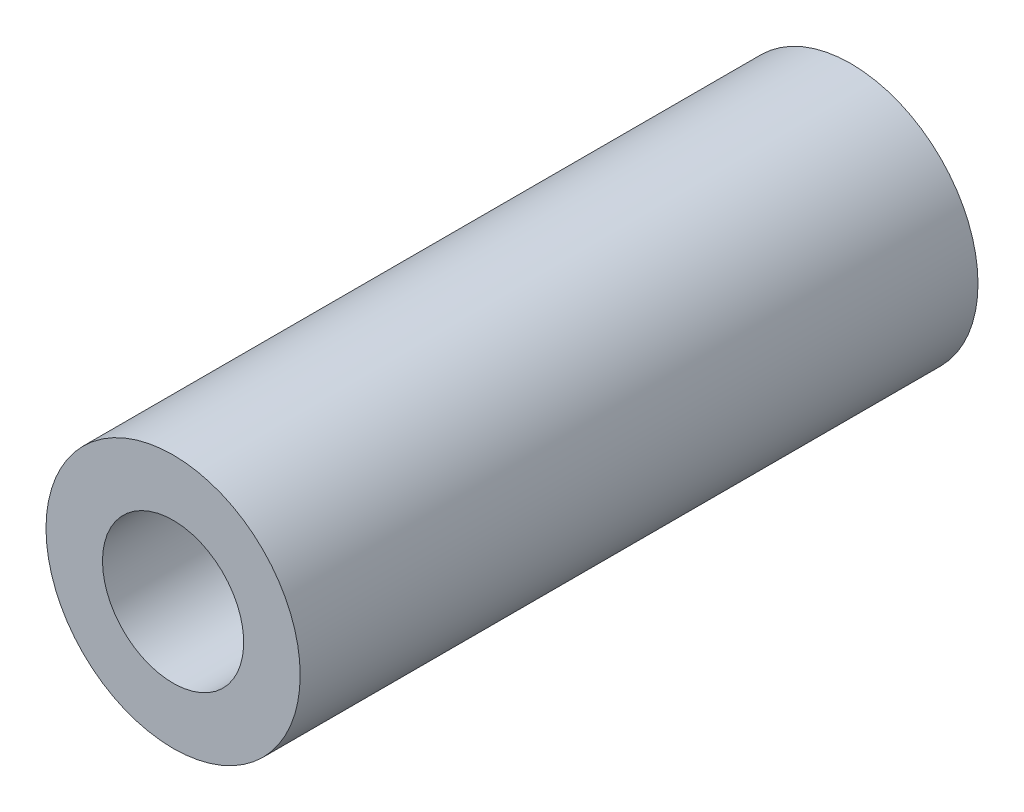
ISO-10303-21;
HEADER;
FILE_DESCRIPTION(('STEP AP214'),'2;1');
FILE_NAME('part.step','',(''),(''),'','','');
FILE_SCHEMA(('AUTOMOTIVE_DESIGN { 1 0 10303 214 1 1 1 1 }'));
ENDSEC;
DATA;
#1=APPLICATION_CONTEXT('core data for automotive mechanical design processes');
#2=APPLICATION_PROTOCOL_DEFINITION('international standard','automotive_design',2000,#1);
#3=PRODUCT_CONTEXT('',#1,'mechanical');
#4=PRODUCT('Part','Part','',(#3));
#5=PRODUCT_RELATED_PRODUCT_CATEGORY('part','',(#4));
#6=PRODUCT_DEFINITION_FORMATION('','',#4);
#7=PRODUCT_DEFINITION_CONTEXT('part definition',#1,'design');
#8=PRODUCT_DEFINITION('design','',#6,#7);
#9=PRODUCT_DEFINITION_SHAPE('','',#8);
#10=(LENGTH_UNIT() NAMED_UNIT(*) SI_UNIT(.MILLI.,.METRE.));
#11=(NAMED_UNIT(*) PLANE_ANGLE_UNIT() SI_UNIT($,.RADIAN.));
#12=(NAMED_UNIT(*) SI_UNIT($,.STERADIAN.) SOLID_ANGLE_UNIT());
#13=UNCERTAINTY_MEASURE_WITH_UNIT(LENGTH_MEASURE(1.E-05),#10,'distance_accuracy_value','');
#14=(GEOMETRIC_REPRESENTATION_CONTEXT(3) GLOBAL_UNCERTAINTY_ASSIGNED_CONTEXT((#13)) GLOBAL_UNIT_ASSIGNED_CONTEXT((#10,
#11,#12)) REPRESENTATION_CONTEXT('',''));
#15=CARTESIAN_POINT('',(0.,0.,0.));
#16=DIRECTION('',(0.,0.,1.));
#17=DIRECTION('',(1.,0.,0.));
#18=AXIS2_PLACEMENT_3D('',#15,#16,#17);
#19=CARTESIAN_POINT('',(0.,0.,76.2));
#20=DIRECTION('',(0.,0.,1.));
#21=DIRECTION('',(1.,0.,0.));
#22=AXIS2_PLACEMENT_3D('',#19,#20,#21);
#23=PLANE('',#22);
#24=CARTESIAN_POINT('',(0.,0.,76.2));
#25=DIRECTION('',(0.,0.,1.));
#26=DIRECTION('',(1.,0.,0.));
#27=AXIS2_PLACEMENT_3D('',#24,#25,#26);
#28=CIRCLE('',#27,28.575);
#29=CARTESIAN_POINT('',(-28.575,0.,76.2));
#30=VERTEX_POINT('',#29);
#31=EDGE_CURVE('E10',#30,#30,#28,.T.);
#32=ORIENTED_EDGE('',*,*,#31,.T.);
#33=EDGE_LOOP('',(#32));
#34=FACE_BOUND('',#33,.T.);
#35=CARTESIAN_POINT('',(0.,0.,76.2));
#36=DIRECTION('',(0.,0.,1.));
#37=DIRECTION('',(1.,0.,0.));
#38=AXIS2_PLACEMENT_3D('',#35,#36,#37);
#39=CIRCLE('',#38,15.875);
#40=CARTESIAN_POINT('',(-15.875,0.,76.2));
#41=VERTEX_POINT('',#40);
#42=EDGE_CURVE('E53',#41,#41,#39,.T.);
#43=ORIENTED_EDGE('',*,*,#42,.F.);
#44=EDGE_LOOP('',(#43));
#45=FACE_BOUND('',#44,.T.);
#46=ADVANCED_FACE('F39',(#34,#45),#23,.T.);
#47=CARTESIAN_POINT('',(0.,0.,-76.2));
#48=DIRECTION('',(0.,0.,1.));
#49=DIRECTION('',(1.,0.,0.));
#50=AXIS2_PLACEMENT_3D('',#47,#48,#49);
#51=PLANE('',#50);
#52=CARTESIAN_POINT('',(0.,0.,-76.2));
#53=DIRECTION('',(0.,0.,1.));
#54=DIRECTION('',(1.,0.,0.));
#55=AXIS2_PLACEMENT_3D('',#52,#53,#54);
#56=CIRCLE('',#55,28.575);
#57=CARTESIAN_POINT('',(-28.575,0.,-76.2));
#58=VERTEX_POINT('',#57);
#59=EDGE_CURVE('E43',#58,#58,#56,.T.);
#60=ORIENTED_EDGE('',*,*,#59,.F.);
#61=EDGE_LOOP('',(#60));
#62=FACE_BOUND('',#61,.T.);
#63=CARTESIAN_POINT('',(0.,0.,-76.2));
#64=DIRECTION('',(0.,0.,1.));
#65=DIRECTION('',(1.,0.,0.));
#66=AXIS2_PLACEMENT_3D('',#63,#64,#65);
#67=CIRCLE('',#66,15.875);
#68=CARTESIAN_POINT('',(-15.875,0.,-76.2));
#69=VERTEX_POINT('',#68);
#70=EDGE_CURVE('E55',#69,#69,#67,.T.);
#71=ORIENTED_EDGE('',*,*,#70,.T.);
#72=EDGE_LOOP('',(#71));
#73=FACE_BOUND('',#72,.T.);
#74=ADVANCED_FACE('F68',(#62,#73),#51,.F.);
#75=CARTESIAN_POINT('',(0.,0.,76.2));
#76=DIRECTION('',(0.,0.,-1.));
#77=DIRECTION('',(-1.,0.,0.));
#78=AXIS2_PLACEMENT_3D('',#75,#76,#77);
#79=CYLINDRICAL_SURFACE('',#78,28.575);
#80=CARTESIAN_POINT('',(-28.575,0.,76.2));
#81=CARTESIAN_POINT('',(-28.575,0.,74.6125));
#82=CARTESIAN_POINT('',(-28.575,0.,73.025));
#83=CARTESIAN_POINT('',(-28.575,0.,69.85));
#84=CARTESIAN_POINT('',(-28.575,0.,68.2625));
#85=CARTESIAN_POINT('',(-28.575,0.,65.0875));
#86=CARTESIAN_POINT('',(-28.575,0.,63.5));
#87=CARTESIAN_POINT('',(-28.575,0.,60.325));
#88=CARTESIAN_POINT('',(-28.575,0.,58.7375));
#89=CARTESIAN_POINT('',(-28.575,0.,55.5625));
#90=CARTESIAN_POINT('',(-28.575,0.,53.975));
#91=CARTESIAN_POINT('',(-28.575,0.,50.8));
#92=CARTESIAN_POINT('',(-28.575,0.,49.2125));
#93=CARTESIAN_POINT('',(-28.575,0.,46.0375));
#94=CARTESIAN_POINT('',(-28.575,0.,44.45));
#95=CARTESIAN_POINT('',(-28.575,0.,41.275));
#96=CARTESIAN_POINT('',(-28.575,0.,39.6875));
#97=CARTESIAN_POINT('',(-28.575,0.,36.5125));
#98=CARTESIAN_POINT('',(-28.575,0.,34.925));
#99=CARTESIAN_POINT('',(-28.575,0.,31.75));
#100=CARTESIAN_POINT('',(-28.575,0.,30.1625));
#101=CARTESIAN_POINT('',(-28.575,0.,26.9875));
#102=CARTESIAN_POINT('',(-28.575,0.,25.4));
#103=CARTESIAN_POINT('',(-28.575,0.,22.225));
#104=CARTESIAN_POINT('',(-28.575,0.,20.6375));
#105=CARTESIAN_POINT('',(-28.575,0.,17.4625));
#106=CARTESIAN_POINT('',(-28.575,0.,15.875));
#107=CARTESIAN_POINT('',(-28.575,0.,12.7));
#108=CARTESIAN_POINT('',(-28.575,0.,11.1125));
#109=CARTESIAN_POINT('',(-28.575,0.,7.93750000000001));
#110=CARTESIAN_POINT('',(-28.575,0.,6.35));
#111=CARTESIAN_POINT('',(-28.575,0.,3.175));
#112=CARTESIAN_POINT('',(-28.575,0.,1.5875));
#113=CARTESIAN_POINT('',(-28.575,0.,-1.5875));
#114=CARTESIAN_POINT('',(-28.575,0.,-3.175));
#115=CARTESIAN_POINT('',(-28.575,0.,-6.35));
#116=CARTESIAN_POINT('',(-28.575,0.,-7.93750000000001));
#117=CARTESIAN_POINT('',(-28.575,0.,-11.1125));
#118=CARTESIAN_POINT('',(-28.575,0.,-12.7));
#119=CARTESIAN_POINT('',(-28.575,0.,-15.875));
#120=CARTESIAN_POINT('',(-28.575,0.,-17.4625));
#121=CARTESIAN_POINT('',(-28.575,0.,-20.6375));
#122=CARTESIAN_POINT('',(-28.575,0.,-22.225));
#123=CARTESIAN_POINT('',(-28.575,0.,-25.4));
#124=CARTESIAN_POINT('',(-28.575,0.,-26.9875));
#125=CARTESIAN_POINT('',(-28.575,0.,-30.1625));
#126=CARTESIAN_POINT('',(-28.575,0.,-31.75));
#127=CARTESIAN_POINT('',(-28.575,0.,-34.925));
#128=CARTESIAN_POINT('',(-28.575,0.,-36.5125));
#129=CARTESIAN_POINT('',(-28.575,0.,-39.6875));
#130=CARTESIAN_POINT('',(-28.575,0.,-41.275));
#131=CARTESIAN_POINT('',(-28.575,0.,-44.45));
#132=CARTESIAN_POINT('',(-28.575,0.,-46.0375));
#133=CARTESIAN_POINT('',(-28.575,0.,-49.2125));
#134=CARTESIAN_POINT('',(-28.575,0.,-50.8));
#135=CARTESIAN_POINT('',(-28.575,0.,-53.975));
#136=CARTESIAN_POINT('',(-28.575,0.,-55.5625));
#137=CARTESIAN_POINT('',(-28.575,0.,-58.7375));
#138=CARTESIAN_POINT('',(-28.575,0.,-60.325));
#139=CARTESIAN_POINT('',(-28.575,0.,-63.5));
#140=CARTESIAN_POINT('',(-28.575,0.,-65.0875));
#141=CARTESIAN_POINT('',(-28.575,0.,-68.2625));
#142=CARTESIAN_POINT('',(-28.575,0.,-69.85));
#143=CARTESIAN_POINT('',(-28.575,0.,-73.025));
#144=CARTESIAN_POINT('',(-28.575,0.,-74.6125));
#145=CARTESIAN_POINT('',(-28.575,0.,-76.2));
#146=B_SPLINE_CURVE_WITH_KNOTS('',3,(#80,#81,#82,#83,#84,#85,#86,#87,#88,#89,#90,#91,#92,#93,
#94,#95,#96,#97,#98,#99,#100,#101,#102,#103,#104,#105,#106,#107,#108,#109,#110,#111,#112,#113,
#114,#115,#116,#117,#118,#119,#120,#121,#122,#123,#124,#125,#126,#127,#128,#129,#130,#131,#132,
#133,#134,#135,#136,#137,#138,#139,#140,#141,#142,#143,#144,#145),.UNSPECIFIED.,.F.,.F.,(4,2,2,
2,2,2,2,2,2,2,2,2,2,2,2,2,2,2,2,2,2,2,2,2,2,2,2,2,2,2,2,2,4),(0.,4.7625,9.52500000000001,
14.2875,19.05,23.8125,28.575,33.3375,38.1,42.8625,47.625,52.3875,57.15,61.9125,66.675,71.4375,
76.2,80.9625,85.725,90.4875,95.25,100.0125,104.775,109.5375,114.3,119.0625,123.825,128.5875,
133.35,138.1125,142.875,147.6375,152.4),.UNSPECIFIED.);
#147=EDGE_CURVE('BSEAM41',#30,#58,#146,.T.);
#148=ORIENTED_EDGE('',*,*,#31,.F.);
#149=ORIENTED_EDGE('',*,*,#59,.T.);
#150=ORIENTED_EDGE('',*,*,#147,.T.);
#151=ORIENTED_EDGE('',*,*,#147,.F.);
#152=EDGE_LOOP('',(#148,#150,#149,#151));
#153=FACE_BOUND('',#152,.T.);
#154=ADVANCED_FACE('F41',(#153),#79,.T.);
#155=CARTESIAN_POINT('',(0.,0.,76.2));
#156=DIRECTION('',(0.,0.,-1.));
#157=DIRECTION('',(-1.,0.,0.));
#158=AXIS2_PLACEMENT_3D('',#155,#156,#157);
#159=CYLINDRICAL_SURFACE('',#158,15.875);
#160=CARTESIAN_POINT('',(-15.875,0.,76.2));
#161=CARTESIAN_POINT('',(-15.875,0.,74.6125));
#162=CARTESIAN_POINT('',(-15.875,0.,73.025));
#163=CARTESIAN_POINT('',(-15.875,0.,69.85));
#164=CARTESIAN_POINT('',(-15.875,0.,68.2625));
#165=CARTESIAN_POINT('',(-15.875,0.,65.0875));
#166=CARTESIAN_POINT('',(-15.875,0.,63.5));
#167=CARTESIAN_POINT('',(-15.875,0.,60.325));
#168=CARTESIAN_POINT('',(-15.875,0.,58.7375));
#169=CARTESIAN_POINT('',(-15.875,0.,55.5625));
#170=CARTESIAN_POINT('',(-15.875,0.,53.975));
#171=CARTESIAN_POINT('',(-15.875,0.,50.8));
#172=CARTESIAN_POINT('',(-15.875,0.,49.2125));
#173=CARTESIAN_POINT('',(-15.875,0.,46.0375));
#174=CARTESIAN_POINT('',(-15.875,0.,44.45));
#175=CARTESIAN_POINT('',(-15.875,0.,41.275));
#176=CARTESIAN_POINT('',(-15.875,0.,39.6875));
#177=CARTESIAN_POINT('',(-15.875,0.,36.5125));
#178=CARTESIAN_POINT('',(-15.875,0.,34.925));
#179=CARTESIAN_POINT('',(-15.875,0.,31.75));
#180=CARTESIAN_POINT('',(-15.875,0.,30.1625));
#181=CARTESIAN_POINT('',(-15.875,0.,26.9875));
#182=CARTESIAN_POINT('',(-15.875,0.,25.4));
#183=CARTESIAN_POINT('',(-15.875,0.,22.225));
#184=CARTESIAN_POINT('',(-15.875,0.,20.6375));
#185=CARTESIAN_POINT('',(-15.875,0.,17.4625));
#186=CARTESIAN_POINT('',(-15.875,0.,15.875));
#187=CARTESIAN_POINT('',(-15.875,0.,12.7));
#188=CARTESIAN_POINT('',(-15.875,0.,11.1125));
#189=CARTESIAN_POINT('',(-15.875,0.,7.93749999999999));
#190=CARTESIAN_POINT('',(-15.875,0.,6.34999999999999));
#191=CARTESIAN_POINT('',(-15.875,0.,3.17499999999999));
#192=CARTESIAN_POINT('',(-15.875,0.,1.58749999999999));
#193=CARTESIAN_POINT('',(-15.875,0.,-1.58750000000001));
#194=CARTESIAN_POINT('',(-15.875,0.,-3.17500000000002));
#195=CARTESIAN_POINT('',(-15.875,0.,-6.35000000000002));
#196=CARTESIAN_POINT('',(-15.875,0.,-7.93750000000002));
#197=CARTESIAN_POINT('',(-15.875,0.,-11.1125));
#198=CARTESIAN_POINT('',(-15.875,0.,-12.7));
#199=CARTESIAN_POINT('',(-15.875,0.,-15.875));
#200=CARTESIAN_POINT('',(-15.875,0.,-17.4625));
#201=CARTESIAN_POINT('',(-15.875,0.,-20.6375));
#202=CARTESIAN_POINT('',(-15.875,0.,-22.225));
#203=CARTESIAN_POINT('',(-15.875,0.,-25.4));
#204=CARTESIAN_POINT('',(-15.875,0.,-26.9875));
#205=CARTESIAN_POINT('',(-15.875,0.,-30.1625));
#206=CARTESIAN_POINT('',(-15.875,0.,-31.75));
#207=CARTESIAN_POINT('',(-15.875,0.,-34.925));
#208=CARTESIAN_POINT('',(-15.875,0.,-36.5125));
#209=CARTESIAN_POINT('',(-15.875,0.,-39.6875));
#210=CARTESIAN_POINT('',(-15.875,0.,-41.275));
#211=CARTESIAN_POINT('',(-15.875,0.,-44.45));
#212=CARTESIAN_POINT('',(-15.875,0.,-46.0375));
#213=CARTESIAN_POINT('',(-15.875,0.,-49.2125));
#214=CARTESIAN_POINT('',(-15.875,0.,-50.8));
#215=CARTESIAN_POINT('',(-15.875,0.,-53.975));
#216=CARTESIAN_POINT('',(-15.875,0.,-55.5625));
#217=CARTESIAN_POINT('',(-15.875,0.,-58.7375));
#218=CARTESIAN_POINT('',(-15.875,0.,-60.325));
#219=CARTESIAN_POINT('',(-15.875,0.,-63.5));
#220=CARTESIAN_POINT('',(-15.875,0.,-65.0875));
#221=CARTESIAN_POINT('',(-15.875,0.,-68.2625));
#222=CARTESIAN_POINT('',(-15.875,0.,-69.85));
#223=CARTESIAN_POINT('',(-15.875,0.,-73.025));
#224=CARTESIAN_POINT('',(-15.875,0.,-74.6125));
#225=CARTESIAN_POINT('',(-15.875,0.,-76.2));
#226=B_SPLINE_CURVE_WITH_KNOTS('',3,(#160,#161,#162,#163,#164,#165,#166,#167,#168,#169,#170,
#171,#172,#173,#174,#175,#176,#177,#178,#179,#180,#181,#182,#183,#184,#185,#186,#187,#188,#189,
#190,#191,#192,#193,#194,#195,#196,#197,#198,#199,#200,#201,#202,#203,#204,#205,#206,#207,#208,
#209,#210,#211,#212,#213,#214,#215,#216,#217,#218,#219,#220,#221,#222,#223,#224,#225),
.UNSPECIFIED.,.F.,.F.,(4,2,2,2,2,2,2,2,2,2,2,2,2,2,2,2,2,2,2,2,2,2,2,2,2,2,2,2,2,2,2,2,4),(0.,
4.76249999999999,9.52499999999999,14.2875,19.05,23.8125,28.575,33.3375,38.1,42.8625,47.625,
52.3875,57.15,61.9125,66.675,71.4375,76.2,80.9625,85.725,90.4875,95.25,100.0125,104.775,
109.5375,114.3,119.0625,123.825,128.5875,133.35,138.1125,142.875,147.6375,152.4),.UNSPECIFIED.);
#227=EDGE_CURVE('BSEAM64',#41,#69,#226,.T.);
#228=ORIENTED_EDGE('',*,*,#42,.T.);
#229=ORIENTED_EDGE('',*,*,#70,.F.);
#230=ORIENTED_EDGE('',*,*,#227,.T.);
#231=ORIENTED_EDGE('',*,*,#227,.F.);
#232=EDGE_LOOP('',(#228,#230,#229,#231));
#233=FACE_BOUND('',#232,.T.);
#234=ADVANCED_FACE('F64',(#233),#159,.F.);
#235=CLOSED_SHELL('',(#46,#74,#154,#234));
#236=MANIFOLD_SOLID_BREP('B2',#235);
#237=ADVANCED_BREP_SHAPE_REPRESENTATION('',(#18,#236),#14);
#238=SHAPE_DEFINITION_REPRESENTATION(#9,#237);
ENDSEC;
END-ISO-10303-21;
